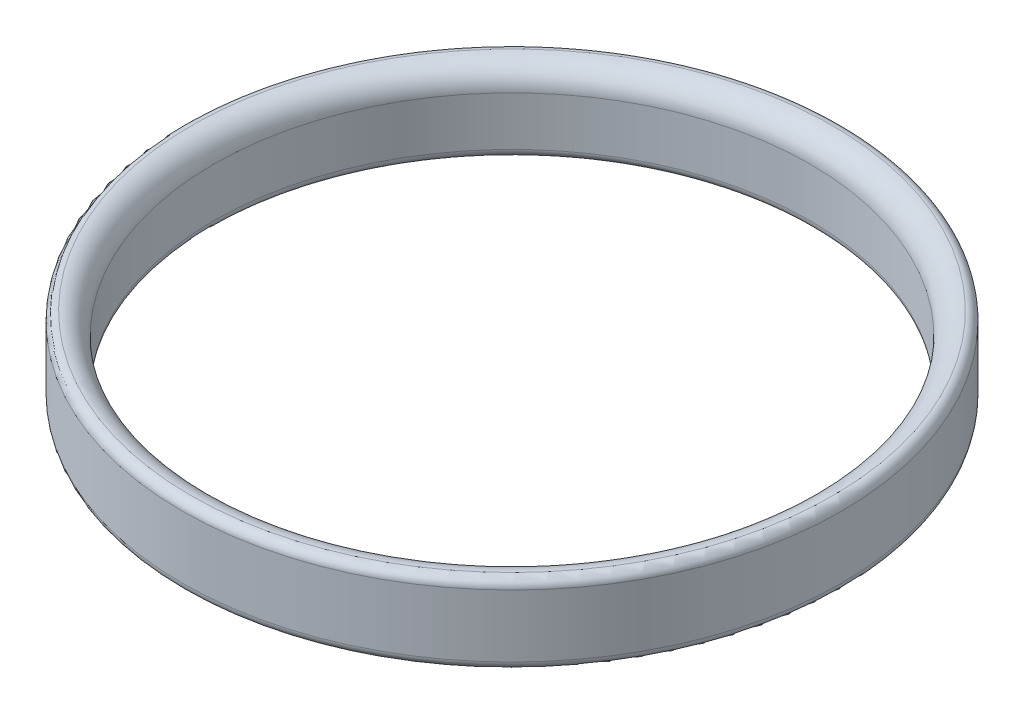
ISO-10303-21;
HEADER;
FILE_DESCRIPTION(('STEP AP214'),'2;1');
FILE_NAME('part.step','',(''),(''),'','','');
FILE_SCHEMA(('AUTOMOTIVE_DESIGN { 1 0 10303 214 1 1 1 1 }'));
ENDSEC;
DATA;
#1=APPLICATION_CONTEXT('core data for automotive mechanical design processes');
#2=APPLICATION_PROTOCOL_DEFINITION('international standard','automotive_design',2000,#1);
#3=PRODUCT_CONTEXT('',#1,'mechanical');
#4=PRODUCT('Part','Part','',(#3));
#5=PRODUCT_RELATED_PRODUCT_CATEGORY('part','',(#4));
#6=PRODUCT_DEFINITION_FORMATION('','',#4);
#7=PRODUCT_DEFINITION_CONTEXT('part definition',#1,'design');
#8=PRODUCT_DEFINITION('design','',#6,#7);
#9=PRODUCT_DEFINITION_SHAPE('','',#8);
#10=(LENGTH_UNIT() NAMED_UNIT(*) SI_UNIT(.MILLI.,.METRE.));
#11=(NAMED_UNIT(*) PLANE_ANGLE_UNIT() SI_UNIT($,.RADIAN.));
#12=(NAMED_UNIT(*) SI_UNIT($,.STERADIAN.) SOLID_ANGLE_UNIT());
#13=UNCERTAINTY_MEASURE_WITH_UNIT(LENGTH_MEASURE(1.E-05),#10,'distance_accuracy_value','');
#14=(GEOMETRIC_REPRESENTATION_CONTEXT(3) GLOBAL_UNCERTAINTY_ASSIGNED_CONTEXT((#13)) GLOBAL_UNIT_ASSIGNED_CONTEXT((#10,
#11,#12)) REPRESENTATION_CONTEXT('',''));
#15=CARTESIAN_POINT('',(0.,0.,0.));
#16=DIRECTION('',(0.,0.,1.));
#17=DIRECTION('',(1.,0.,0.));
#18=AXIS2_PLACEMENT_3D('',#15,#16,#17);
#19=CARTESIAN_POINT('',(0.,0.,0.));
#20=DIRECTION('',(0.,1.,0.));
#21=DIRECTION('',(0.,0.,1.));
#22=AXIS2_PLACEMENT_3D('',#19,#20,#21);
#23=PLANE('',#22);
#24=CARTESIAN_POINT('',(0.,0.,0.));
#25=DIRECTION('',(0.,1.,0.));
#26=DIRECTION('',(0.,0.,1.));
#27=AXIS2_PLACEMENT_3D('',#24,#25,#26);
#28=CIRCLE('',#27,7.2);
#29=CARTESIAN_POINT('',(0.,0.,7.2));
#30=VERTEX_POINT('',#29);
#31=EDGE_CURVE('E38',#30,#30,#28,.F.);
#32=ORIENTED_EDGE('',*,*,#31,.T.);
#33=EDGE_LOOP('',(#32));
#34=FACE_BOUND('',#33,.T.);
#35=CARTESIAN_POINT('',(0.,0.,0.));
#36=DIRECTION('',(0.,1.,0.));
#37=DIRECTION('',(0.,0.,1.));
#38=AXIS2_PLACEMENT_3D('',#35,#36,#37);
#39=CIRCLE('',#38,6.9);
#40=CARTESIAN_POINT('',(0.,0.,6.9));
#41=VERTEX_POINT('',#40);
#42=EDGE_CURVE('E42',#41,#41,#39,.T.);
#43=ORIENTED_EDGE('',*,*,#42,.T.);
#44=EDGE_LOOP('',(#43));
#45=FACE_BOUND('',#44,.T.);
#46=ADVANCED_FACE('F31',(#34,#45),#23,.F.);
#47=CARTESIAN_POINT('',(0.,1.8,0.));
#48=DIRECTION('',(0.,-1.,0.));
#49=DIRECTION('',(0.,0.,-1.));
#50=AXIS2_PLACEMENT_3D('',#47,#48,#49);
#51=CYLINDRICAL_SURFACE('',#50,7.4);
#52=CARTESIAN_POINT('',(0.,0.2,0.));
#53=DIRECTION('',(0.,1.,0.));
#54=DIRECTION('',(0.,0.,1.));
#55=AXIS2_PLACEMENT_3D('',#52,#53,#54);
#56=CIRCLE('',#55,7.4);
#57=CARTESIAN_POINT('',(0.,0.2,7.4));
#58=VERTEX_POINT('',#57);
#59=EDGE_CURVE('E46',#58,#58,#56,.T.);
#60=ORIENTED_EDGE('',*,*,#59,.T.);
#61=EDGE_LOOP('',(#60));
#62=FACE_BOUND('',#61,.T.);
#63=CARTESIAN_POINT('',(0.,1.6,0.));
#64=DIRECTION('',(0.,1.,0.));
#65=DIRECTION('',(0.,0.,1.));
#66=AXIS2_PLACEMENT_3D('',#63,#64,#65);
#67=CIRCLE('',#66,7.4);
#68=CARTESIAN_POINT('',(0.,1.6,7.4));
#69=VERTEX_POINT('',#68);
#70=EDGE_CURVE('E51',#69,#69,#67,.F.);
#71=ORIENTED_EDGE('',*,*,#70,.T.);
#72=EDGE_LOOP('',(#71));
#73=FACE_BOUND('',#72,.T.);
#74=ADVANCED_FACE('F76',(#62,#73),#51,.T.);
#75=CARTESIAN_POINT('',(0.,1.8,0.));
#76=DIRECTION('',(0.,-1.,0.));
#77=DIRECTION('',(0.,0.,-1.));
#78=AXIS2_PLACEMENT_3D('',#75,#76,#77);
#79=CYLINDRICAL_SURFACE('',#78,6.7);
#80=CARTESIAN_POINT('',(0.,0.2,0.));
#81=DIRECTION('',(0.,1.,0.));
#82=DIRECTION('',(0.,0.,1.));
#83=AXIS2_PLACEMENT_3D('',#80,#81,#82);
#84=CIRCLE('',#83,6.7);
#85=CARTESIAN_POINT('',(0.,0.2,6.7));
#86=VERTEX_POINT('',#85);
#87=EDGE_CURVE('E10',#86,#86,#84,.F.);
#88=ORIENTED_EDGE('',*,*,#87,.T.);
#89=EDGE_LOOP('',(#88));
#90=FACE_BOUND('',#89,.T.);
#91=CARTESIAN_POINT('',(0.,1.3,0.));
#92=DIRECTION('',(0.,1.,0.));
#93=DIRECTION('',(0.,0.,1.));
#94=AXIS2_PLACEMENT_3D('',#91,#92,#93);
#95=CIRCLE('',#94,6.7);
#96=CARTESIAN_POINT('',(0.,1.3,6.7));
#97=VERTEX_POINT('',#96);
#98=EDGE_CURVE('E57',#97,#97,#95,.T.);
#99=ORIENTED_EDGE('',*,*,#98,.T.);
#100=EDGE_LOOP('',(#99));
#101=FACE_BOUND('',#100,.T.);
#102=ADVANCED_FACE('F61',(#90,#101),#79,.F.);
#103=CARTESIAN_POINT('',(0.,1.3,0.));
#104=DIRECTION('',(0.,1.,0.));
#105=DIRECTION('',(0.,0.,1.));
#106=AXIS2_PLACEMENT_3D('',#103,#104,#105);
#107=TOROIDAL_SURFACE('',#106,7.2,0.5);
#108=CARTESIAN_POINT('',(0.,1.8,0.));
#109=DIRECTION('',(0.,1.,0.));
#110=DIRECTION('',(0.,0.,1.));
#111=AXIS2_PLACEMENT_3D('',#108,#109,#110);
#112=CIRCLE('',#111,7.2);
#113=CARTESIAN_POINT('',(0.,1.8,7.2));
#114=VERTEX_POINT('',#113);
#115=EDGE_CURVE('E54',#114,#114,#112,.F.);
#116=ORIENTED_EDGE('',*,*,#115,.F.);
#117=EDGE_LOOP('',(#116));
#118=FACE_BOUND('',#117,.T.);
#119=ORIENTED_EDGE('',*,*,#98,.F.);
#120=EDGE_LOOP('',(#119));
#121=FACE_BOUND('',#120,.T.);
#122=ADVANCED_FACE('F63',(#118,#121),#107,.T.);
#123=CARTESIAN_POINT('',(0.,0.2,0.));
#124=DIRECTION('',(0.,1.,0.));
#125=DIRECTION('',(0.,0.,1.));
#126=AXIS2_PLACEMENT_3D('',#123,#124,#125);
#127=TOROIDAL_SURFACE('',#126,7.2,0.2);
#128=ORIENTED_EDGE('',*,*,#31,.F.);
#129=EDGE_LOOP('',(#128));
#130=FACE_BOUND('',#129,.T.);
#131=ORIENTED_EDGE('',*,*,#59,.F.);
#132=EDGE_LOOP('',(#131));
#133=FACE_BOUND('',#132,.T.);
#134=ADVANCED_FACE('F65',(#130,#133),#127,.T.);
#135=CARTESIAN_POINT('',(0.,1.6,0.));
#136=DIRECTION('',(0.,1.,0.));
#137=DIRECTION('',(0.,0.,1.));
#138=AXIS2_PLACEMENT_3D('',#135,#136,#137);
#139=TOROIDAL_SURFACE('',#138,7.2,0.2);
#140=ORIENTED_EDGE('',*,*,#70,.F.);
#141=EDGE_LOOP('',(#140));
#142=FACE_BOUND('',#141,.T.);
#143=ORIENTED_EDGE('',*,*,#115,.T.);
#144=EDGE_LOOP('',(#143));
#145=FACE_BOUND('',#144,.T.);
#146=ADVANCED_FACE('F72',(#142,#145),#139,.T.);
#147=CARTESIAN_POINT('',(0.,0.2,0.));
#148=DIRECTION('',(0.,1.,0.));
#149=DIRECTION('',(0.,0.,1.));
#150=AXIS2_PLACEMENT_3D('',#147,#148,#149);
#151=TOROIDAL_SURFACE('',#150,6.9,0.2);
#152=ORIENTED_EDGE('',*,*,#87,.F.);
#153=EDGE_LOOP('',(#152));
#154=FACE_BOUND('',#153,.T.);
#155=ORIENTED_EDGE('',*,*,#42,.F.);
#156=EDGE_LOOP('',(#155));
#157=FACE_BOUND('',#156,.T.);
#158=ADVANCED_FACE('F33',(#154,#157),#151,.T.);
#159=CLOSED_SHELL('',(#46,#74,#102,#122,#134,#146,#158));
#160=MANIFOLD_SOLID_BREP('B2',#159);
#161=ADVANCED_BREP_SHAPE_REPRESENTATION('',(#18,#160),#14);
#162=SHAPE_DEFINITION_REPRESENTATION(#9,#161);
ENDSEC;
END-ISO-10303-21;
